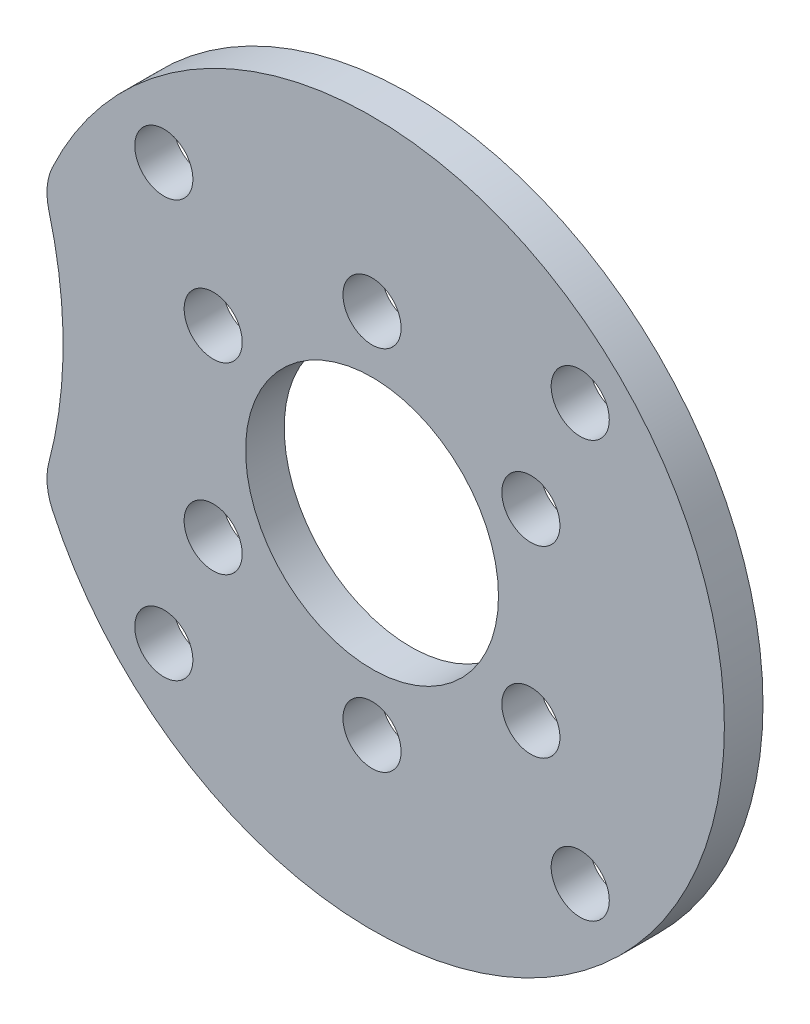
ISO-10303-21;
HEADER;
FILE_DESCRIPTION(('STEP AP214'),'2;1');
FILE_NAME('part.step','',(''),(''),'','','');
FILE_SCHEMA(('AUTOMOTIVE_DESIGN { 1 0 10303 214 1 1 1 1 }'));
ENDSEC;
DATA;
#1=APPLICATION_CONTEXT('core data for automotive mechanical design processes');
#2=APPLICATION_PROTOCOL_DEFINITION('international standard','automotive_design',2000,#1);
#3=PRODUCT_CONTEXT('',#1,'mechanical');
#4=PRODUCT('Part','Part','',(#3));
#5=PRODUCT_RELATED_PRODUCT_CATEGORY('part','',(#4));
#6=PRODUCT_DEFINITION_FORMATION('','',#4);
#7=PRODUCT_DEFINITION_CONTEXT('part definition',#1,'design');
#8=PRODUCT_DEFINITION('design','',#6,#7);
#9=PRODUCT_DEFINITION_SHAPE('','',#8);
#10=(LENGTH_UNIT() NAMED_UNIT(*) SI_UNIT(.MILLI.,.METRE.));
#11=(NAMED_UNIT(*) PLANE_ANGLE_UNIT() SI_UNIT($,.RADIAN.));
#12=(NAMED_UNIT(*) SI_UNIT($,.STERADIAN.) SOLID_ANGLE_UNIT());
#13=UNCERTAINTY_MEASURE_WITH_UNIT(LENGTH_MEASURE(1.E-05),#10,'distance_accuracy_value','');
#14=(GEOMETRIC_REPRESENTATION_CONTEXT(3) GLOBAL_UNCERTAINTY_ASSIGNED_CONTEXT((#13)) GLOBAL_UNIT_ASSIGNED_CONTEXT((#10,
#11,#12)) REPRESENTATION_CONTEXT('',''));
#15=CARTESIAN_POINT('',(0.,0.,0.));
#16=DIRECTION('',(0.,0.,1.));
#17=DIRECTION('',(1.,0.,0.));
#18=AXIS2_PLACEMENT_3D('',#15,#16,#17);
#19=CARTESIAN_POINT('',(0.,0.,2.));
#20=DIRECTION('',(0.,0.,1.));
#21=DIRECTION('',(1.,0.,0.));
#22=AXIS2_PLACEMENT_3D('',#19,#20,#21);
#23=PLANE('',#22);
#24=CARTESIAN_POINT('',(-10.7833784130949,-10.7833784130948,2.));
#25=DIRECTION('',(0.,0.,1.));
#26=DIRECTION('',(1.,0.,0.));
#27=AXIS2_PLACEMENT_3D('',#24,#25,#26);
#28=CIRCLE('',#27,1.505);
#29=CARTESIAN_POINT('',(-9.27837841309491,-10.7833784130948,2.));
#30=VERTEX_POINT('',#29);
#31=EDGE_CURVE('E236',#30,#30,#28,.T.);
#32=ORIENTED_EDGE('',*,*,#31,.F.);
#33=EDGE_LOOP('',(#32));
#34=FACE_BOUND('',#33,.T.);
#35=CARTESIAN_POINT('',(10.7833784130948,-10.7833784130949,2.));
#36=DIRECTION('',(0.,0.,1.));
#37=DIRECTION('',(1.,0.,0.));
#38=AXIS2_PLACEMENT_3D('',#35,#36,#37);
#39=CIRCLE('',#38,1.505);
#40=CARTESIAN_POINT('',(12.2883784130948,-10.7833784130949,2.));
#41=VERTEX_POINT('',#40);
#42=EDGE_CURVE('E242',#41,#41,#39,.T.);
#43=ORIENTED_EDGE('',*,*,#42,.F.);
#44=EDGE_LOOP('',(#43));
#45=FACE_BOUND('',#44,.T.);
#46=CARTESIAN_POINT('',(10.7833784130949,10.7833784130948,2.));
#47=DIRECTION('',(0.,0.,1.));
#48=DIRECTION('',(1.,0.,0.));
#49=AXIS2_PLACEMENT_3D('',#46,#47,#48);
#50=CIRCLE('',#49,1.505);
#51=CARTESIAN_POINT('',(12.2883784130949,10.7833784130948,2.));
#52=VERTEX_POINT('',#51);
#53=EDGE_CURVE('E248',#52,#52,#50,.T.);
#54=ORIENTED_EDGE('',*,*,#53,.F.);
#55=EDGE_LOOP('',(#54));
#56=FACE_BOUND('',#55,.T.);
#57=CARTESIAN_POINT('',(-10.7833784130948,10.7833784130949,2.));
#58=DIRECTION('',(0.,0.,1.));
#59=DIRECTION('',(1.,0.,0.));
#60=AXIS2_PLACEMENT_3D('',#57,#58,#59);
#61=CIRCLE('',#60,1.505);
#62=CARTESIAN_POINT('',(-9.27837841309479,10.7833784130949,2.));
#63=VERTEX_POINT('',#62);
#64=EDGE_CURVE('E230',#63,#63,#61,.T.);
#65=ORIENTED_EDGE('',*,*,#64,.F.);
#66=EDGE_LOOP('',(#65));
#67=FACE_BOUND('',#66,.T.);
#68=CARTESIAN_POINT('',(0.,-9.5,2.));
#69=DIRECTION('',(0.,0.,1.));
#70=DIRECTION('',(-1.,0.,0.));
#71=AXIS2_PLACEMENT_3D('',#68,#69,#70);
#72=CIRCLE('',#71,1.505);
#73=CARTESIAN_POINT('',(-1.505,-9.5,2.));
#74=VERTEX_POINT('',#73);
#75=EDGE_CURVE('E205',#74,#74,#72,.T.);
#76=ORIENTED_EDGE('',*,*,#75,.F.);
#77=EDGE_LOOP('',(#76));
#78=FACE_BOUND('',#77,.T.);
#79=CARTESIAN_POINT('',(-8.22724133595218,4.74999999999998,2.));
#80=DIRECTION('',(0.,0.,1.));
#81=DIRECTION('',(-1.,0.,0.));
#82=AXIS2_PLACEMENT_3D('',#79,#80,#81);
#83=CIRCLE('',#82,1.505);
#84=CARTESIAN_POINT('',(-9.73224133595218,4.74999999999998,2.));
#85=VERTEX_POINT('',#84);
#86=EDGE_CURVE('E222',#85,#85,#83,.T.);
#87=ORIENTED_EDGE('',*,*,#86,.F.);
#88=EDGE_LOOP('',(#87));
#89=FACE_BOUND('',#88,.T.);
#90=CARTESIAN_POINT('',(8.22724133595218,4.74999999999998,2.));
#91=DIRECTION('',(0.,0.,1.));
#92=DIRECTION('',(-1.,0.,0.));
#93=AXIS2_PLACEMENT_3D('',#90,#91,#92);
#94=CIRCLE('',#93,1.505);
#95=CARTESIAN_POINT('',(6.72224133595218,4.74999999999998,2.));
#96=VERTEX_POINT('',#95);
#97=EDGE_CURVE('E215',#96,#96,#94,.T.);
#98=ORIENTED_EDGE('',*,*,#97,.F.);
#99=EDGE_LOOP('',(#98));
#100=FACE_BOUND('',#99,.T.);
#101=CARTESIAN_POINT('',(0.,9.5,2.));
#102=DIRECTION('',(0.,0.,1.));
#103=DIRECTION('',(1.,0.,0.));
#104=AXIS2_PLACEMENT_3D('',#101,#102,#103);
#105=CIRCLE('',#104,1.505);
#106=CARTESIAN_POINT('',(1.505,9.5,2.));
#107=VERTEX_POINT('',#106);
#108=EDGE_CURVE('E119',#107,#107,#105,.T.);
#109=ORIENTED_EDGE('',*,*,#108,.F.);
#110=EDGE_LOOP('',(#109));
#111=FACE_BOUND('',#110,.T.);
#112=CARTESIAN_POINT('',(8.22724133595218,-4.74999999999998,2.));
#113=DIRECTION('',(0.,0.,1.));
#114=DIRECTION('',(1.,0.,0.));
#115=AXIS2_PLACEMENT_3D('',#112,#113,#114);
#116=CIRCLE('',#115,1.505);
#117=CARTESIAN_POINT('',(9.73224133595218,-4.74999999999998,2.));
#118=VERTEX_POINT('',#117);
#119=EDGE_CURVE('E202',#118,#118,#116,.T.);
#120=ORIENTED_EDGE('',*,*,#119,.F.);
#121=EDGE_LOOP('',(#120));
#122=FACE_BOUND('',#121,.T.);
#123=CARTESIAN_POINT('',(-8.22724133595218,-4.74999999999998,2.));
#124=DIRECTION('',(0.,0.,1.));
#125=DIRECTION('',(1.,0.,0.));
#126=AXIS2_PLACEMENT_3D('',#123,#124,#125);
#127=CIRCLE('',#126,1.505);
#128=CARTESIAN_POINT('',(-6.72224133595218,-4.74999999999998,2.));
#129=VERTEX_POINT('',#128);
#130=EDGE_CURVE('E199',#129,#129,#127,.T.);
#131=ORIENTED_EDGE('',*,*,#130,.F.);
#132=EDGE_LOOP('',(#131));
#133=FACE_BOUND('',#132,.T.);
#134=CARTESIAN_POINT('',(-38.,0.,2.));
#135=DIRECTION('',(0.,0.,1.));
#136=DIRECTION('',(1.,0.,0.));
#137=AXIS2_PLACEMENT_3D('',#134,#135,#136);
#138=CIRCLE('',#137,22.);
#139=CARTESIAN_POINT('',(-16.7359868421053,-5.64284896314614,2.));
#140=VERTEX_POINT('',#139);
#141=CARTESIAN_POINT('',(-16.7359868421053,5.64284896314614,2.));
#142=VERTEX_POINT('',#141);
#143=EDGE_CURVE('E112',#140,#142,#138,.T.);
#144=ORIENTED_EDGE('',*,*,#143,.F.);
#145=CARTESIAN_POINT('',(-13.8363486842105,-6.41232836721152,2.));
#146=DIRECTION('',(0.,0.,1.));
#147=DIRECTION('',(1.,0.,0.));
#148=AXIS2_PLACEMENT_3D('',#145,#146,#147);
#149=CIRCLE('',#148,3.);
#150=CARTESIAN_POINT('',(-16.5582533433995,-7.67377001322035,2.));
#151=VERTEX_POINT('',#150);
#152=EDGE_CURVE('E11',#140,#151,#149,.T.);
#153=ORIENTED_EDGE('',*,*,#152,.T.);
#154=CARTESIAN_POINT('',(0.,0.,2.));
#155=DIRECTION('',(0.,0.,1.));
#156=DIRECTION('',(1.,0.,0.));
#157=AXIS2_PLACEMENT_3D('',#154,#155,#156);
#158=CIRCLE('',#157,18.25);
#159=CARTESIAN_POINT('',(-16.5582533433995,7.67377001322035,2.));
#160=VERTEX_POINT('',#159);
#161=EDGE_CURVE('E92',#151,#160,#158,.T.);
#162=ORIENTED_EDGE('',*,*,#161,.T.);
#163=CARTESIAN_POINT('',(-13.8363486842105,6.41232836721152,2.));
#164=DIRECTION('',(0.,0.,1.));
#165=DIRECTION('',(1.,0.,0.));
#166=AXIS2_PLACEMENT_3D('',#163,#164,#165);
#167=CIRCLE('',#166,3.);
#168=EDGE_CURVE('E43',#160,#142,#167,.T.);
#169=ORIENTED_EDGE('',*,*,#168,.T.);
#170=EDGE_LOOP('',(#144,#153,#162,#169));
#171=FACE_BOUND('',#170,.T.);
#172=CARTESIAN_POINT('',(0.,0.,2.));
#173=DIRECTION('',(0.,0.,1.));
#174=DIRECTION('',(1.,0.,0.));
#175=AXIS2_PLACEMENT_3D('',#172,#173,#174);
#176=CIRCLE('',#175,6.55);
#177=CARTESIAN_POINT('',(6.55,0.,2.));
#178=VERTEX_POINT('',#177);
#179=EDGE_CURVE('E98',#178,#178,#176,.T.);
#180=ORIENTED_EDGE('',*,*,#179,.F.);
#181=EDGE_LOOP('',(#180));
#182=FACE_BOUND('',#181,.T.);
#183=ADVANCED_FACE('F35',(#34,#45,#56,#67,#78,#89,#100,#111,#122,#133,#171,#182),#23,.T.);
#184=CARTESIAN_POINT('',(0.,0.,0.));
#185=DIRECTION('',(0.,0.,1.));
#186=DIRECTION('',(1.,0.,0.));
#187=AXIS2_PLACEMENT_3D('',#184,#185,#186);
#188=PLANE('',#187);
#189=CARTESIAN_POINT('',(-10.7833784130949,-10.7833784130948,0.));
#190=DIRECTION('',(0.,0.,1.));
#191=DIRECTION('',(1.,0.,0.));
#192=AXIS2_PLACEMENT_3D('',#189,#190,#191);
#193=CIRCLE('',#192,1.505);
#194=CARTESIAN_POINT('',(-9.27837841309491,-10.7833784130948,0.));
#195=VERTEX_POINT('',#194);
#196=EDGE_CURVE('E239',#195,#195,#193,.T.);
#197=ORIENTED_EDGE('',*,*,#196,.T.);
#198=EDGE_LOOP('',(#197));
#199=FACE_BOUND('',#198,.T.);
#200=CARTESIAN_POINT('',(10.7833784130948,-10.7833784130949,0.));
#201=DIRECTION('',(0.,0.,1.));
#202=DIRECTION('',(1.,0.,0.));
#203=AXIS2_PLACEMENT_3D('',#200,#201,#202);
#204=CIRCLE('',#203,1.505);
#205=CARTESIAN_POINT('',(12.2883784130948,-10.7833784130949,0.));
#206=VERTEX_POINT('',#205);
#207=EDGE_CURVE('E245',#206,#206,#204,.T.);
#208=ORIENTED_EDGE('',*,*,#207,.T.);
#209=EDGE_LOOP('',(#208));
#210=FACE_BOUND('',#209,.T.);
#211=CARTESIAN_POINT('',(10.7833784130949,10.7833784130948,0.));
#212=DIRECTION('',(0.,0.,1.));
#213=DIRECTION('',(1.,0.,0.));
#214=AXIS2_PLACEMENT_3D('',#211,#212,#213);
#215=CIRCLE('',#214,1.505);
#216=CARTESIAN_POINT('',(12.2883784130949,10.7833784130948,0.));
#217=VERTEX_POINT('',#216);
#218=EDGE_CURVE('E233',#217,#217,#215,.T.);
#219=ORIENTED_EDGE('',*,*,#218,.T.);
#220=EDGE_LOOP('',(#219));
#221=FACE_BOUND('',#220,.T.);
#222=CARTESIAN_POINT('',(-10.7833784130948,10.7833784130949,0.));
#223=DIRECTION('',(0.,0.,1.));
#224=DIRECTION('',(1.,0.,0.));
#225=AXIS2_PLACEMENT_3D('',#222,#223,#224);
#226=CIRCLE('',#225,1.505);
#227=CARTESIAN_POINT('',(-9.27837841309479,10.7833784130949,0.));
#228=VERTEX_POINT('',#227);
#229=EDGE_CURVE('E219',#228,#228,#226,.T.);
#230=ORIENTED_EDGE('',*,*,#229,.T.);
#231=EDGE_LOOP('',(#230));
#232=FACE_BOUND('',#231,.T.);
#233=CARTESIAN_POINT('',(0.,-9.5,0.));
#234=DIRECTION('',(0.,0.,1.));
#235=DIRECTION('',(-1.,0.,0.));
#236=AXIS2_PLACEMENT_3D('',#233,#234,#235);
#237=CIRCLE('',#236,1.505);
#238=CARTESIAN_POINT('',(-1.505,-9.5,0.));
#239=VERTEX_POINT('',#238);
#240=EDGE_CURVE('E201',#239,#239,#237,.T.);
#241=ORIENTED_EDGE('',*,*,#240,.T.);
#242=EDGE_LOOP('',(#241));
#243=FACE_BOUND('',#242,.T.);
#244=CARTESIAN_POINT('',(-8.22724133595218,4.74999999999998,0.));
#245=DIRECTION('',(0.,0.,1.));
#246=DIRECTION('',(-1.,0.,0.));
#247=AXIS2_PLACEMENT_3D('',#244,#245,#246);
#248=CIRCLE('',#247,1.505);
#249=CARTESIAN_POINT('',(-9.73224133595218,4.74999999999998,0.));
#250=VERTEX_POINT('',#249);
#251=EDGE_CURVE('E225',#250,#250,#248,.T.);
#252=ORIENTED_EDGE('',*,*,#251,.T.);
#253=EDGE_LOOP('',(#252));
#254=FACE_BOUND('',#253,.T.);
#255=CARTESIAN_POINT('',(8.22724133595218,4.74999999999998,0.));
#256=DIRECTION('',(0.,0.,1.));
#257=DIRECTION('',(-1.,0.,0.));
#258=AXIS2_PLACEMENT_3D('',#255,#256,#257);
#259=CIRCLE('',#258,1.505);
#260=CARTESIAN_POINT('',(6.72224133595218,4.74999999999998,0.));
#261=VERTEX_POINT('',#260);
#262=EDGE_CURVE('E218',#261,#261,#259,.T.);
#263=ORIENTED_EDGE('',*,*,#262,.T.);
#264=EDGE_LOOP('',(#263));
#265=FACE_BOUND('',#264,.T.);
#266=CARTESIAN_POINT('',(0.,9.5,0.));
#267=DIRECTION('',(0.,0.,1.));
#268=DIRECTION('',(1.,0.,0.));
#269=AXIS2_PLACEMENT_3D('',#266,#267,#268);
#270=CIRCLE('',#269,1.505);
#271=CARTESIAN_POINT('',(1.505,9.5,0.));
#272=VERTEX_POINT('',#271);
#273=EDGE_CURVE('E116',#272,#272,#270,.T.);
#274=ORIENTED_EDGE('',*,*,#273,.T.);
#275=EDGE_LOOP('',(#274));
#276=FACE_BOUND('',#275,.T.);
#277=CARTESIAN_POINT('',(8.22724133595218,-4.74999999999998,0.));
#278=DIRECTION('',(0.,0.,1.));
#279=DIRECTION('',(1.,0.,0.));
#280=AXIS2_PLACEMENT_3D('',#277,#278,#279);
#281=CIRCLE('',#280,1.505);
#282=CARTESIAN_POINT('',(9.73224133595218,-4.74999999999998,0.));
#283=VERTEX_POINT('',#282);
#284=EDGE_CURVE('E210',#283,#283,#281,.T.);
#285=ORIENTED_EDGE('',*,*,#284,.T.);
#286=EDGE_LOOP('',(#285));
#287=FACE_BOUND('',#286,.T.);
#288=CARTESIAN_POINT('',(-8.22724133595218,-4.74999999999998,0.));
#289=DIRECTION('',(0.,0.,1.));
#290=DIRECTION('',(1.,0.,0.));
#291=AXIS2_PLACEMENT_3D('',#288,#289,#290);
#292=CIRCLE('',#291,1.505);
#293=CARTESIAN_POINT('',(-6.72224133595218,-4.74999999999998,0.));
#294=VERTEX_POINT('',#293);
#295=EDGE_CURVE('E196',#294,#294,#292,.T.);
#296=ORIENTED_EDGE('',*,*,#295,.T.);
#297=EDGE_LOOP('',(#296));
#298=FACE_BOUND('',#297,.T.);
#299=CARTESIAN_POINT('',(0.,0.,0.));
#300=DIRECTION('',(0.,0.,1.));
#301=DIRECTION('',(1.,0.,0.));
#302=AXIS2_PLACEMENT_3D('',#299,#300,#301);
#303=CIRCLE('',#302,18.25);
#304=CARTESIAN_POINT('',(-16.5582533433995,-7.67377001322035,0.));
#305=VERTEX_POINT('',#304);
#306=CARTESIAN_POINT('',(-16.5582533433995,7.67377001322035,0.));
#307=VERTEX_POINT('',#306);
#308=EDGE_CURVE('E90',#305,#307,#303,.T.);
#309=ORIENTED_EDGE('',*,*,#308,.F.);
#310=CARTESIAN_POINT('',(-13.8363486842105,-6.41232836721152,0.));
#311=DIRECTION('',(0.,0.,1.));
#312=DIRECTION('',(1.,0.,0.));
#313=AXIS2_PLACEMENT_3D('',#310,#311,#312);
#314=CIRCLE('',#313,3.);
#315=CARTESIAN_POINT('',(-16.7359868421053,-5.64284896314614,0.));
#316=VERTEX_POINT('',#315);
#317=EDGE_CURVE('E74',#305,#316,#314,.F.);
#318=ORIENTED_EDGE('',*,*,#317,.T.);
#319=CARTESIAN_POINT('',(-38.,0.,0.));
#320=DIRECTION('',(0.,0.,1.));
#321=DIRECTION('',(1.,0.,0.));
#322=AXIS2_PLACEMENT_3D('',#319,#320,#321);
#323=CIRCLE('',#322,22.);
#324=CARTESIAN_POINT('',(-16.7359868421053,5.64284896314614,0.));
#325=VERTEX_POINT('',#324);
#326=EDGE_CURVE('E111',#316,#325,#323,.T.);
#327=ORIENTED_EDGE('',*,*,#326,.T.);
#328=CARTESIAN_POINT('',(-13.8363486842105,6.41232836721152,0.));
#329=DIRECTION('',(0.,0.,1.));
#330=DIRECTION('',(1.,0.,0.));
#331=AXIS2_PLACEMENT_3D('',#328,#329,#330);
#332=CIRCLE('',#331,3.);
#333=EDGE_CURVE('E83',#325,#307,#332,.F.);
#334=ORIENTED_EDGE('',*,*,#333,.T.);
#335=EDGE_LOOP('',(#309,#318,#327,#334));
#336=FACE_BOUND('',#335,.T.);
#337=CARTESIAN_POINT('',(0.,0.,0.));
#338=DIRECTION('',(0.,0.,1.));
#339=DIRECTION('',(1.,0.,0.));
#340=AXIS2_PLACEMENT_3D('',#337,#338,#339);
#341=CIRCLE('',#340,6.55);
#342=CARTESIAN_POINT('',(6.55,0.,0.));
#343=VERTEX_POINT('',#342);
#344=EDGE_CURVE('E102',#343,#343,#341,.T.);
#345=ORIENTED_EDGE('',*,*,#344,.T.);
#346=EDGE_LOOP('',(#345));
#347=FACE_BOUND('',#346,.T.);
#348=ADVANCED_FACE('F95',(#199,#210,#221,#232,#243,#254,#265,#276,#287,#298,#336,#347),#188,.F.);
#349=CARTESIAN_POINT('',(0.,0.,2.));
#350=DIRECTION('',(0.,0.,-1.));
#351=DIRECTION('',(-1.,0.,0.));
#352=AXIS2_PLACEMENT_3D('',#349,#350,#351);
#353=CYLINDRICAL_SURFACE('',#352,18.25);
#354=ORIENTED_EDGE('',*,*,#161,.F.);
#355=DIRECTION('',(0.,0.,-1.));
#356=VECTOR('',#355,1.);
#357=CARTESIAN_POINT('',(-16.5582533433995,-7.67377001322035,2.));
#358=LINE('',#357,#356);
#359=EDGE_CURVE('E78',#151,#305,#358,.T.);
#360=ORIENTED_EDGE('',*,*,#359,.T.);
#361=ORIENTED_EDGE('',*,*,#308,.T.);
#362=DIRECTION('',(0.,0.,-1.));
#363=VECTOR('',#362,1.);
#364=CARTESIAN_POINT('',(-16.5582533433995,7.67377001322035,2.));
#365=LINE('',#364,#363);
#366=EDGE_CURVE('E93',#307,#160,#365,.F.);
#367=ORIENTED_EDGE('',*,*,#366,.T.);
#368=EDGE_LOOP('',(#354,#360,#361,#367));
#369=FACE_BOUND('',#368,.T.);
#370=ADVANCED_FACE('F88',(#369),#353,.T.);
#371=CARTESIAN_POINT('',(0.,0.,2.));
#372=DIRECTION('',(0.,0.,-1.));
#373=DIRECTION('',(-1.,0.,0.));
#374=AXIS2_PLACEMENT_3D('',#371,#372,#373);
#375=CYLINDRICAL_SURFACE('',#374,6.55);
#376=ORIENTED_EDGE('',*,*,#179,.T.);
#377=EDGE_LOOP('',(#376));
#378=FACE_BOUND('',#377,.T.);
#379=ORIENTED_EDGE('',*,*,#344,.F.);
#380=EDGE_LOOP('',(#379));
#381=FACE_BOUND('',#380,.T.);
#382=ADVANCED_FACE('F125',(#378,#381),#375,.F.);
#383=CARTESIAN_POINT('',(-38.,0.,0.));
#384=DIRECTION('',(0.,0.,1.));
#385=DIRECTION('',(1.,0.,0.));
#386=AXIS2_PLACEMENT_3D('',#383,#384,#385);
#387=CYLINDRICAL_SURFACE('',#386,22.);
#388=ORIENTED_EDGE('',*,*,#326,.F.);
#389=DIRECTION('',(0.,0.,1.));
#390=VECTOR('',#389,1.);
#391=CARTESIAN_POINT('',(-16.7359868421053,-5.64284896314614,0.));
#392=LINE('',#391,#390);
#393=EDGE_CURVE('E56',#316,#140,#392,.T.);
#394=ORIENTED_EDGE('',*,*,#393,.T.);
#395=ORIENTED_EDGE('',*,*,#143,.T.);
#396=DIRECTION('',(0.,0.,1.));
#397=VECTOR('',#396,1.);
#398=CARTESIAN_POINT('',(-16.7359868421053,5.64284896314614,0.));
#399=LINE('',#398,#397);
#400=EDGE_CURVE('E82',#142,#325,#399,.F.);
#401=ORIENTED_EDGE('',*,*,#400,.T.);
#402=EDGE_LOOP('',(#388,#394,#395,#401));
#403=FACE_BOUND('',#402,.T.);
#404=ADVANCED_FACE('F110',(#403),#387,.F.);
#405=CARTESIAN_POINT('',(-8.22724133595218,-4.74999999999998,0.));
#406=DIRECTION('',(0.,0.,1.));
#407=DIRECTION('',(1.,0.,0.));
#408=AXIS2_PLACEMENT_3D('',#405,#406,#407);
#409=CYLINDRICAL_SURFACE('',#408,1.505);
#410=ORIENTED_EDGE('',*,*,#295,.F.);
#411=EDGE_LOOP('',(#410));
#412=FACE_BOUND('',#411,.T.);
#413=ORIENTED_EDGE('',*,*,#130,.T.);
#414=EDGE_LOOP('',(#413));
#415=FACE_BOUND('',#414,.T.);
#416=ADVANCED_FACE('F133',(#412,#415),#409,.F.);
#417=CARTESIAN_POINT('',(8.22724133595218,-4.74999999999998,0.));
#418=DIRECTION('',(0.,0.,1.));
#419=DIRECTION('',(1.,0.,0.));
#420=AXIS2_PLACEMENT_3D('',#417,#418,#419);
#421=CYLINDRICAL_SURFACE('',#420,1.505);
#422=ORIENTED_EDGE('',*,*,#284,.F.);
#423=EDGE_LOOP('',(#422));
#424=FACE_BOUND('',#423,.T.);
#425=ORIENTED_EDGE('',*,*,#119,.T.);
#426=EDGE_LOOP('',(#425));
#427=FACE_BOUND('',#426,.T.);
#428=ADVANCED_FACE('F184',(#424,#427),#421,.F.);
#429=CARTESIAN_POINT('',(0.,9.5,0.));
#430=DIRECTION('',(0.,0.,1.));
#431=DIRECTION('',(1.,0.,0.));
#432=AXIS2_PLACEMENT_3D('',#429,#430,#431);
#433=CYLINDRICAL_SURFACE('',#432,1.505);
#434=ORIENTED_EDGE('',*,*,#273,.F.);
#435=EDGE_LOOP('',(#434));
#436=FACE_BOUND('',#435,.T.);
#437=ORIENTED_EDGE('',*,*,#108,.T.);
#438=EDGE_LOOP('',(#437));
#439=FACE_BOUND('',#438,.T.);
#440=ADVANCED_FACE('F180',(#436,#439),#433,.F.);
#441=CARTESIAN_POINT('',(8.22724133595218,4.74999999999998,0.));
#442=DIRECTION('',(0.,0.,1.));
#443=DIRECTION('',(1.,0.,0.));
#444=AXIS2_PLACEMENT_3D('',#441,#442,#443);
#445=CYLINDRICAL_SURFACE('',#444,1.505);
#446=ORIENTED_EDGE('',*,*,#262,.F.);
#447=EDGE_LOOP('',(#446));
#448=FACE_BOUND('',#447,.T.);
#449=ORIENTED_EDGE('',*,*,#97,.T.);
#450=EDGE_LOOP('',(#449));
#451=FACE_BOUND('',#450,.T.);
#452=ADVANCED_FACE('F176',(#448,#451),#445,.F.);
#453=CARTESIAN_POINT('',(-8.22724133595218,4.74999999999998,0.));
#454=DIRECTION('',(0.,0.,1.));
#455=DIRECTION('',(1.,0.,0.));
#456=AXIS2_PLACEMENT_3D('',#453,#454,#455);
#457=CYLINDRICAL_SURFACE('',#456,1.505);
#458=ORIENTED_EDGE('',*,*,#251,.F.);
#459=EDGE_LOOP('',(#458));
#460=FACE_BOUND('',#459,.T.);
#461=ORIENTED_EDGE('',*,*,#86,.T.);
#462=EDGE_LOOP('',(#461));
#463=FACE_BOUND('',#462,.T.);
#464=ADVANCED_FACE('F172',(#460,#463),#457,.F.);
#465=CARTESIAN_POINT('',(0.,-9.5,0.));
#466=DIRECTION('',(0.,0.,1.));
#467=DIRECTION('',(1.,0.,0.));
#468=AXIS2_PLACEMENT_3D('',#465,#466,#467);
#469=CYLINDRICAL_SURFACE('',#468,1.505);
#470=ORIENTED_EDGE('',*,*,#240,.F.);
#471=EDGE_LOOP('',(#470));
#472=FACE_BOUND('',#471,.T.);
#473=ORIENTED_EDGE('',*,*,#75,.T.);
#474=EDGE_LOOP('',(#473));
#475=FACE_BOUND('',#474,.T.);
#476=ADVANCED_FACE('F168',(#472,#475),#469,.F.);
#477=CARTESIAN_POINT('',(-10.7833784130948,10.7833784130949,0.));
#478=DIRECTION('',(0.,0.,1.));
#479=DIRECTION('',(1.,0.,0.));
#480=AXIS2_PLACEMENT_3D('',#477,#478,#479);
#481=CYLINDRICAL_SURFACE('',#480,1.505);
#482=ORIENTED_EDGE('',*,*,#229,.F.);
#483=EDGE_LOOP('',(#482));
#484=FACE_BOUND('',#483,.T.);
#485=ORIENTED_EDGE('',*,*,#64,.T.);
#486=EDGE_LOOP('',(#485));
#487=FACE_BOUND('',#486,.T.);
#488=ADVANCED_FACE('F165',(#484,#487),#481,.F.);
#489=CARTESIAN_POINT('',(10.7833784130949,10.7833784130948,0.));
#490=DIRECTION('',(0.,0.,1.));
#491=DIRECTION('',(1.,0.,0.));
#492=AXIS2_PLACEMENT_3D('',#489,#490,#491);
#493=CYLINDRICAL_SURFACE('',#492,1.505);
#494=ORIENTED_EDGE('',*,*,#218,.F.);
#495=EDGE_LOOP('',(#494));
#496=FACE_BOUND('',#495,.T.);
#497=ORIENTED_EDGE('',*,*,#53,.T.);
#498=EDGE_LOOP('',(#497));
#499=FACE_BOUND('',#498,.T.);
#500=ADVANCED_FACE('F158',(#496,#499),#493,.F.);
#501=CARTESIAN_POINT('',(10.7833784130948,-10.7833784130949,0.));
#502=DIRECTION('',(0.,0.,1.));
#503=DIRECTION('',(1.,0.,0.));
#504=AXIS2_PLACEMENT_3D('',#501,#502,#503);
#505=CYLINDRICAL_SURFACE('',#504,1.505);
#506=ORIENTED_EDGE('',*,*,#207,.F.);
#507=EDGE_LOOP('',(#506));
#508=FACE_BOUND('',#507,.T.);
#509=ORIENTED_EDGE('',*,*,#42,.T.);
#510=EDGE_LOOP('',(#509));
#511=FACE_BOUND('',#510,.T.);
#512=ADVANCED_FACE('F152',(#508,#511),#505,.F.);
#513=CARTESIAN_POINT('',(-10.7833784130949,-10.7833784130948,0.));
#514=DIRECTION('',(0.,0.,1.));
#515=DIRECTION('',(1.,0.,0.));
#516=AXIS2_PLACEMENT_3D('',#513,#514,#515);
#517=CYLINDRICAL_SURFACE('',#516,1.505);
#518=ORIENTED_EDGE('',*,*,#196,.F.);
#519=EDGE_LOOP('',(#518));
#520=FACE_BOUND('',#519,.T.);
#521=ORIENTED_EDGE('',*,*,#31,.T.);
#522=EDGE_LOOP('',(#521));
#523=FACE_BOUND('',#522,.T.);
#524=ADVANCED_FACE('F147',(#520,#523),#517,.F.);
#525=CARTESIAN_POINT('',(-13.8363486842105,-6.41232836721152,0.));
#526=DIRECTION('',(0.,0.,1.));
#527=DIRECTION('',(1.,0.,0.));
#528=AXIS2_PLACEMENT_3D('',#525,#526,#527);
#529=CYLINDRICAL_SURFACE('',#528,3.);
#530=ORIENTED_EDGE('',*,*,#152,.F.);
#531=ORIENTED_EDGE('',*,*,#393,.F.);
#532=ORIENTED_EDGE('',*,*,#317,.F.);
#533=ORIENTED_EDGE('',*,*,#359,.F.);
#534=EDGE_LOOP('',(#530,#531,#532,#533));
#535=FACE_BOUND('',#534,.T.);
#536=ADVANCED_FACE('F77',(#535),#529,.T.);
#537=CARTESIAN_POINT('',(-13.8363486842105,6.41232836721152,0.));
#538=DIRECTION('',(0.,0.,-1.));
#539=DIRECTION('',(-1.,0.,0.));
#540=AXIS2_PLACEMENT_3D('',#537,#538,#539);
#541=CYLINDRICAL_SURFACE('',#540,3.);
#542=ORIENTED_EDGE('',*,*,#333,.F.);
#543=ORIENTED_EDGE('',*,*,#400,.F.);
#544=ORIENTED_EDGE('',*,*,#168,.F.);
#545=ORIENTED_EDGE('',*,*,#366,.F.);
#546=EDGE_LOOP('',(#542,#543,#544,#545));
#547=FACE_BOUND('',#546,.T.);
#548=ADVANCED_FACE('F37',(#547),#541,.T.);
#549=CLOSED_SHELL('',(#183,#348,#370,#382,#404,#416,#428,#440,#452,#464,#476,#488,#500,#512,
#524,#536,#548));
#550=MANIFOLD_SOLID_BREP('B2',#549);
#551=ADVANCED_BREP_SHAPE_REPRESENTATION('',(#18,#550),#14);
#552=SHAPE_DEFINITION_REPRESENTATION(#9,#551);
ENDSEC;
END-ISO-10303-21;
